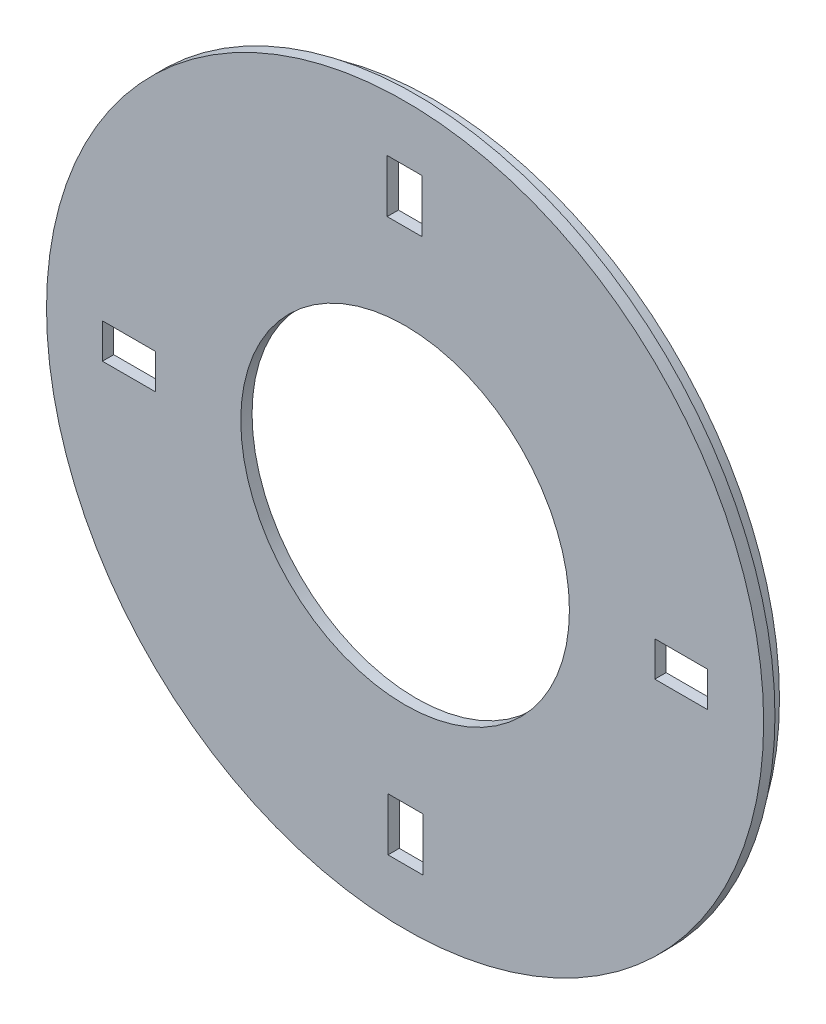
ISO-10303-21;
HEADER;
FILE_DESCRIPTION(('STEP AP214'),'2;1');
FILE_NAME('part.step','',(''),(''),'','','');
FILE_SCHEMA(('AUTOMOTIVE_DESIGN { 1 0 10303 214 1 1 1 1 }'));
ENDSEC;
DATA;
#1=APPLICATION_CONTEXT('core data for automotive mechanical design processes');
#2=APPLICATION_PROTOCOL_DEFINITION('international standard','automotive_design',2000,#1);
#3=PRODUCT_CONTEXT('',#1,'mechanical');
#4=PRODUCT('Part','Part','',(#3));
#5=PRODUCT_RELATED_PRODUCT_CATEGORY('part','',(#4));
#6=PRODUCT_DEFINITION_FORMATION('','',#4);
#7=PRODUCT_DEFINITION_CONTEXT('part definition',#1,'design');
#8=PRODUCT_DEFINITION('design','',#6,#7);
#9=PRODUCT_DEFINITION_SHAPE('','',#8);
#10=(LENGTH_UNIT() NAMED_UNIT(*) SI_UNIT(.MILLI.,.METRE.));
#11=(NAMED_UNIT(*) PLANE_ANGLE_UNIT() SI_UNIT($,.RADIAN.));
#12=(NAMED_UNIT(*) SI_UNIT($,.STERADIAN.) SOLID_ANGLE_UNIT());
#13=UNCERTAINTY_MEASURE_WITH_UNIT(LENGTH_MEASURE(1.E-05),#10,'distance_accuracy_value','');
#14=(GEOMETRIC_REPRESENTATION_CONTEXT(3) GLOBAL_UNCERTAINTY_ASSIGNED_CONTEXT((#13)) GLOBAL_UNIT_ASSIGNED_CONTEXT((#10,
#11,#12)) REPRESENTATION_CONTEXT('',''));
#15=CARTESIAN_POINT('',(0.,0.,0.));
#16=DIRECTION('',(0.,0.,1.));
#17=DIRECTION('',(1.,0.,0.));
#18=AXIS2_PLACEMENT_3D('',#15,#16,#17);
#19=CARTESIAN_POINT('',(0.,0.,0.));
#20=DIRECTION('',(0.,0.,1.));
#21=DIRECTION('',(1.,0.,0.));
#22=AXIS2_PLACEMENT_3D('',#19,#20,#21);
#23=PLANE('',#22);
#24=DIRECTION('',(-1.,0.,0.));
#25=VECTOR('',#24,1.);
#26=CARTESIAN_POINT('',(3.17213324801856,-44.2196209835935,0.));
#27=LINE('',#26,#25);
#28=CARTESIAN_POINT('',(3.17213324801856,-44.2196209835935,0.));
#29=VERTEX_POINT('',#28);
#30=CARTESIAN_POINT('',(-3.02546675198144,-44.2196209835934,0.));
#31=VERTEX_POINT('',#30);
#32=EDGE_CURVE('E75',#29,#31,#27,.T.);
#33=ORIENTED_EDGE('',*,*,#32,.T.);
#34=DIRECTION('',(0.,-1.,0.));
#35=VECTOR('',#34,1.);
#36=CARTESIAN_POINT('',(-3.02546675198154,-53.5922209835934,0.));
#37=LINE('',#36,#35);
#38=CARTESIAN_POINT('',(-3.02546675198154,-53.5922209835934,0.));
#39=VERTEX_POINT('',#38);
#40=EDGE_CURVE('E181',#31,#39,#37,.T.);
#41=ORIENTED_EDGE('',*,*,#40,.T.);
#42=DIRECTION('',(1.,0.,0.));
#43=VECTOR('',#42,1.);
#44=CARTESIAN_POINT('',(3.17213324801846,-53.5922209835935,0.));
#45=LINE('',#44,#43);
#46=CARTESIAN_POINT('',(3.17213324801846,-53.5922209835935,0.));
#47=VERTEX_POINT('',#46);
#48=EDGE_CURVE('E203',#39,#47,#45,.T.);
#49=ORIENTED_EDGE('',*,*,#48,.T.);
#50=DIRECTION('',(0.,1.,0.));
#51=VECTOR('',#50,1.);
#52=CARTESIAN_POINT('',(3.17213324801846,-53.5922209835935,0.));
#53=LINE('',#52,#51);
#54=EDGE_CURVE('E175',#47,#29,#53,.T.);
#55=ORIENTED_EDGE('',*,*,#54,.T.);
#56=EDGE_LOOP('',(#33,#41,#49,#55));
#57=FACE_BOUND('',#56,.T.);
#58=DIRECTION('',(1.,0.,0.));
#59=VECTOR('',#58,1.);
#60=CARTESIAN_POINT('',(-3.17213324801887,44.2196209835935,0.));
#61=LINE('',#60,#59);
#62=CARTESIAN_POINT('',(-3.17213324801887,44.2196209835935,0.));
#63=VERTEX_POINT('',#62);
#64=CARTESIAN_POINT('',(3.02546675198113,44.2196209835934,0.));
#65=VERTEX_POINT('',#64);
#66=EDGE_CURVE('E258',#63,#65,#61,.T.);
#67=ORIENTED_EDGE('',*,*,#66,.T.);
#68=DIRECTION('',(0.,1.,0.));
#69=VECTOR('',#68,1.);
#70=CARTESIAN_POINT('',(3.02546675198116,53.5922209835934,0.));
#71=LINE('',#70,#69);
#72=CARTESIAN_POINT('',(3.02546675198116,53.5922209835934,0.));
#73=VERTEX_POINT('',#72);
#74=EDGE_CURVE('E277',#65,#73,#71,.T.);
#75=ORIENTED_EDGE('',*,*,#74,.T.);
#76=DIRECTION('',(-1.,0.,0.));
#77=VECTOR('',#76,1.);
#78=CARTESIAN_POINT('',(-3.17213324801884,53.5922209835934,0.));
#79=LINE('',#78,#77);
#80=CARTESIAN_POINT('',(-3.17213324801884,53.5922209835934,0.));
#81=VERTEX_POINT('',#80);
#82=EDGE_CURVE('E281',#73,#81,#79,.T.);
#83=ORIENTED_EDGE('',*,*,#82,.T.);
#84=DIRECTION('',(0.,-1.,0.));
#85=VECTOR('',#84,1.);
#86=CARTESIAN_POINT('',(-3.17213324801884,53.5922209835934,0.));
#87=LINE('',#86,#85);
#88=EDGE_CURVE('E263',#81,#63,#87,.T.);
#89=ORIENTED_EDGE('',*,*,#88,.T.);
#90=EDGE_LOOP('',(#67,#75,#83,#89));
#91=FACE_BOUND('',#90,.T.);
#92=CARTESIAN_POINT('',(0.,0.,0.));
#93=DIRECTION('',(0.,0.,1.));
#94=DIRECTION('',(1.,0.,0.));
#95=AXIS2_PLACEMENT_3D('',#92,#93,#94);
#96=CIRCLE('',#95,29.1);
#97=CARTESIAN_POINT('',(29.1,0.,0.));
#98=VERTEX_POINT('',#97);
#99=EDGE_CURVE('E344',#98,#98,#96,.T.);
#100=ORIENTED_EDGE('',*,*,#99,.T.);
#101=EDGE_LOOP('',(#100));
#102=FACE_BOUND('',#101,.T.);
#103=DIRECTION('',(-1.,0.,0.));
#104=VECTOR('',#103,1.);
#105=CARTESIAN_POINT('',(-53.5922209835934,3.02546675198097,0.));
#106=LINE('',#105,#104);
#107=CARTESIAN_POINT('',(-44.2196209835935,3.02546675198098,0.));
#108=VERTEX_POINT('',#107);
#109=CARTESIAN_POINT('',(-53.5922209835934,3.02546675198097,0.));
#110=VERTEX_POINT('',#109);
#111=EDGE_CURVE('E301',#108,#110,#106,.T.);
#112=ORIENTED_EDGE('',*,*,#111,.T.);
#113=DIRECTION('',(0.,-1.,0.));
#114=VECTOR('',#113,1.);
#115=CARTESIAN_POINT('',(-53.5922209835934,-3.17213324801902,0.));
#116=LINE('',#115,#114);
#117=CARTESIAN_POINT('',(-53.5922209835934,-3.17213324801902,0.));
#118=VERTEX_POINT('',#117);
#119=EDGE_CURVE('E320',#110,#118,#116,.T.);
#120=ORIENTED_EDGE('',*,*,#119,.T.);
#121=DIRECTION('',(1.,0.,0.));
#122=VECTOR('',#121,1.);
#123=CARTESIAN_POINT('',(-53.5922209835934,-3.17213324801902,0.));
#124=LINE('',#123,#122);
#125=CARTESIAN_POINT('',(-44.2196209835934,-3.17213324801902,0.));
#126=VERTEX_POINT('',#125);
#127=EDGE_CURVE('E324',#118,#126,#124,.T.);
#128=ORIENTED_EDGE('',*,*,#127,.T.);
#129=DIRECTION('',(0.,1.,0.));
#130=VECTOR('',#129,1.);
#131=CARTESIAN_POINT('',(-44.2196209835934,-3.17213324801902,0.));
#132=LINE('',#131,#130);
#133=EDGE_CURVE('E306',#126,#108,#132,.T.);
#134=ORIENTED_EDGE('',*,*,#133,.T.);
#135=EDGE_LOOP('',(#112,#120,#128,#134));
#136=FACE_BOUND('',#135,.T.);
#137=DIRECTION('',(0.,-1.,0.));
#138=VECTOR('',#137,1.);
#139=CARTESIAN_POINT('',(44.2196209835935,3.17213324801871,0.));
#140=LINE('',#139,#138);
#141=CARTESIAN_POINT('',(44.2196209835935,3.17213324801871,0.));
#142=VERTEX_POINT('',#141);
#143=CARTESIAN_POINT('',(44.2196209835934,-3.02546675198129,0.));
#144=VERTEX_POINT('',#143);
#145=EDGE_CURVE('E183',#142,#144,#140,.T.);
#146=ORIENTED_EDGE('',*,*,#145,.T.);
#147=DIRECTION('',(1.,0.,0.));
#148=VECTOR('',#147,1.);
#149=CARTESIAN_POINT('',(53.5922209835934,-3.02546675198135,0.));
#150=LINE('',#149,#148);
#151=CARTESIAN_POINT('',(53.5922209835934,-3.02546675198135,0.));
#152=VERTEX_POINT('',#151);
#153=EDGE_CURVE('E234',#144,#152,#150,.T.);
#154=ORIENTED_EDGE('',*,*,#153,.T.);
#155=DIRECTION('',(0.,1.,0.));
#156=VECTOR('',#155,1.);
#157=CARTESIAN_POINT('',(53.5922209835934,3.17213324801865,0.));
#158=LINE('',#157,#156);
#159=CARTESIAN_POINT('',(53.5922209835934,3.17213324801865,0.));
#160=VERTEX_POINT('',#159);
#161=EDGE_CURVE('E238',#152,#160,#158,.T.);
#162=ORIENTED_EDGE('',*,*,#161,.T.);
#163=DIRECTION('',(-1.,0.,0.));
#164=VECTOR('',#163,1.);
#165=CARTESIAN_POINT('',(53.5922209835934,3.17213324801865,0.));
#166=LINE('',#165,#164);
#167=EDGE_CURVE('E220',#160,#142,#166,.T.);
#168=ORIENTED_EDGE('',*,*,#167,.T.);
#169=EDGE_LOOP('',(#146,#154,#162,#168));
#170=FACE_BOUND('',#169,.T.);
#171=CARTESIAN_POINT('',(0.,0.,0.));
#172=DIRECTION('',(0.,0.,-1.));
#173=DIRECTION('',(-1.,0.,0.));
#174=AXIS2_PLACEMENT_3D('',#171,#172,#173);
#175=CIRCLE('',#174,59.8);
#176=CARTESIAN_POINT('',(-59.8,0.,0.));
#177=VERTEX_POINT('',#176);
#178=EDGE_CURVE('E386',#177,#177,#175,.T.);
#179=ORIENTED_EDGE('',*,*,#178,.T.);
#180=EDGE_LOOP('',(#179));
#181=FACE_BOUND('',#180,.T.);
#182=ADVANCED_FACE('F51',(#57,#91,#102,#136,#170,#181),#23,.F.);
#183=CARTESIAN_POINT('',(0.,0.,2.));
#184=DIRECTION('',(0.,0.,1.));
#185=DIRECTION('',(1.,0.,0.));
#186=AXIS2_PLACEMENT_3D('',#183,#184,#185);
#187=PLANE('',#186);
#188=CARTESIAN_POINT('',(0.,0.,2.));
#189=DIRECTION('',(0.,0.,1.));
#190=DIRECTION('',(1.,0.,0.));
#191=AXIS2_PLACEMENT_3D('',#188,#189,#190);
#192=CIRCLE('',#191,63.5);
#193=CARTESIAN_POINT('',(63.5,0.,2.));
#194=VERTEX_POINT('',#193);
#195=EDGE_CURVE('E60',#194,#194,#192,.T.);
#196=ORIENTED_EDGE('',*,*,#195,.T.);
#197=EDGE_LOOP('',(#196));
#198=FACE_BOUND('',#197,.T.);
#199=CARTESIAN_POINT('',(0.,0.,2.));
#200=DIRECTION('',(0.,0.,1.));
#201=DIRECTION('',(1.,0.,0.));
#202=AXIS2_PLACEMENT_3D('',#199,#200,#201);
#203=CIRCLE('',#202,29.1);
#204=CARTESIAN_POINT('',(29.1,0.,2.));
#205=VERTEX_POINT('',#204);
#206=EDGE_CURVE('E345',#205,#205,#203,.T.);
#207=ORIENTED_EDGE('',*,*,#206,.F.);
#208=EDGE_LOOP('',(#207));
#209=FACE_BOUND('',#208,.T.);
#210=DIRECTION('',(0.,-1.,0.));
#211=VECTOR('',#210,1.);
#212=CARTESIAN_POINT('',(-53.5922209835934,-3.17213324801902,2.));
#213=LINE('',#212,#211);
#214=CARTESIAN_POINT('',(-53.5922209835934,3.02546675198097,2.));
#215=VERTEX_POINT('',#214);
#216=CARTESIAN_POINT('',(-53.5922209835934,-3.17213324801902,2.));
#217=VERTEX_POINT('',#216);
#218=EDGE_CURVE('E305',#215,#217,#213,.T.);
#219=ORIENTED_EDGE('',*,*,#218,.F.);
#220=DIRECTION('',(-1.,0.,0.));
#221=VECTOR('',#220,1.);
#222=CARTESIAN_POINT('',(-53.5922209835934,3.02546675198097,2.));
#223=LINE('',#222,#221);
#224=CARTESIAN_POINT('',(-44.2196209835935,3.02546675198098,2.));
#225=VERTEX_POINT('',#224);
#226=EDGE_CURVE('E302',#225,#215,#223,.T.);
#227=ORIENTED_EDGE('',*,*,#226,.F.);
#228=DIRECTION('',(0.,1.,0.));
#229=VECTOR('',#228,1.);
#230=CARTESIAN_POINT('',(-44.2196209835934,-3.17213324801902,2.));
#231=LINE('',#230,#229);
#232=CARTESIAN_POINT('',(-44.2196209835934,-3.17213324801902,2.));
#233=VERTEX_POINT('',#232);
#234=EDGE_CURVE('E313',#233,#225,#231,.T.);
#235=ORIENTED_EDGE('',*,*,#234,.F.);
#236=DIRECTION('',(1.,0.,0.));
#237=VECTOR('',#236,1.);
#238=CARTESIAN_POINT('',(-53.5922209835934,-3.17213324801902,2.));
#239=LINE('',#238,#237);
#240=EDGE_CURVE('E309',#217,#233,#239,.T.);
#241=ORIENTED_EDGE('',*,*,#240,.F.);
#242=EDGE_LOOP('',(#219,#227,#235,#241));
#243=FACE_BOUND('',#242,.T.);
#244=DIRECTION('',(0.,1.,0.));
#245=VECTOR('',#244,1.);
#246=CARTESIAN_POINT('',(3.02546675198116,53.5922209835934,2.));
#247=LINE('',#246,#245);
#248=CARTESIAN_POINT('',(3.02546675198113,44.2196209835934,2.));
#249=VERTEX_POINT('',#248);
#250=CARTESIAN_POINT('',(3.02546675198116,53.5922209835934,2.));
#251=VERTEX_POINT('',#250);
#252=EDGE_CURVE('E262',#249,#251,#247,.T.);
#253=ORIENTED_EDGE('',*,*,#252,.F.);
#254=DIRECTION('',(1.,0.,0.));
#255=VECTOR('',#254,1.);
#256=CARTESIAN_POINT('',(-3.17213324801887,44.2196209835935,2.));
#257=LINE('',#256,#255);
#258=CARTESIAN_POINT('',(-3.17213324801887,44.2196209835935,2.));
#259=VERTEX_POINT('',#258);
#260=EDGE_CURVE('E259',#259,#249,#257,.T.);
#261=ORIENTED_EDGE('',*,*,#260,.F.);
#262=DIRECTION('',(0.,-1.,0.));
#263=VECTOR('',#262,1.);
#264=CARTESIAN_POINT('',(-3.17213324801884,53.5922209835934,2.));
#265=LINE('',#264,#263);
#266=CARTESIAN_POINT('',(-3.17213324801884,53.5922209835934,2.));
#267=VERTEX_POINT('',#266);
#268=EDGE_CURVE('E270',#267,#259,#265,.T.);
#269=ORIENTED_EDGE('',*,*,#268,.F.);
#270=DIRECTION('',(-1.,0.,0.));
#271=VECTOR('',#270,1.);
#272=CARTESIAN_POINT('',(-3.17213324801884,53.5922209835934,2.));
#273=LINE('',#272,#271);
#274=EDGE_CURVE('E266',#251,#267,#273,.T.);
#275=ORIENTED_EDGE('',*,*,#274,.F.);
#276=EDGE_LOOP('',(#253,#261,#269,#275));
#277=FACE_BOUND('',#276,.T.);
#278=DIRECTION('',(1.,0.,0.));
#279=VECTOR('',#278,1.);
#280=CARTESIAN_POINT('',(53.5922209835934,-3.02546675198135,2.));
#281=LINE('',#280,#279);
#282=CARTESIAN_POINT('',(44.2196209835934,-3.02546675198129,2.));
#283=VERTEX_POINT('',#282);
#284=CARTESIAN_POINT('',(53.5922209835934,-3.02546675198135,2.));
#285=VERTEX_POINT('',#284);
#286=EDGE_CURVE('E219',#283,#285,#281,.T.);
#287=ORIENTED_EDGE('',*,*,#286,.F.);
#288=DIRECTION('',(0.,-1.,0.));
#289=VECTOR('',#288,1.);
#290=CARTESIAN_POINT('',(44.2196209835935,3.17213324801871,2.));
#291=LINE('',#290,#289);
#292=CARTESIAN_POINT('',(44.2196209835935,3.17213324801871,2.));
#293=VERTEX_POINT('',#292);
#294=EDGE_CURVE('E216',#293,#283,#291,.T.);
#295=ORIENTED_EDGE('',*,*,#294,.F.);
#296=DIRECTION('',(-1.,0.,0.));
#297=VECTOR('',#296,1.);
#298=CARTESIAN_POINT('',(53.5922209835934,3.17213324801865,2.));
#299=LINE('',#298,#297);
#300=CARTESIAN_POINT('',(53.5922209835934,3.17213324801865,2.));
#301=VERTEX_POINT('',#300);
#302=EDGE_CURVE('E227',#301,#293,#299,.T.);
#303=ORIENTED_EDGE('',*,*,#302,.F.);
#304=DIRECTION('',(0.,1.,0.));
#305=VECTOR('',#304,1.);
#306=CARTESIAN_POINT('',(53.5922209835934,3.17213324801865,2.));
#307=LINE('',#306,#305);
#308=EDGE_CURVE('E223',#285,#301,#307,.T.);
#309=ORIENTED_EDGE('',*,*,#308,.F.);
#310=EDGE_LOOP('',(#287,#295,#303,#309));
#311=FACE_BOUND('',#310,.T.);
#312=DIRECTION('',(0.,-1.,0.));
#313=VECTOR('',#312,1.);
#314=CARTESIAN_POINT('',(-3.02546675198154,-53.5922209835934,2.));
#315=LINE('',#314,#313);
#316=CARTESIAN_POINT('',(-3.02546675198144,-44.2196209835934,2.));
#317=VERTEX_POINT('',#316);
#318=CARTESIAN_POINT('',(-3.02546675198154,-53.5922209835934,2.));
#319=VERTEX_POINT('',#318);
#320=EDGE_CURVE('E174',#317,#319,#315,.T.);
#321=ORIENTED_EDGE('',*,*,#320,.F.);
#322=DIRECTION('',(-1.,0.,0.));
#323=VECTOR('',#322,1.);
#324=CARTESIAN_POINT('',(3.17213324801856,-44.2196209835935,2.));
#325=LINE('',#324,#323);
#326=CARTESIAN_POINT('',(3.17213324801856,-44.2196209835935,2.));
#327=VERTEX_POINT('',#326);
#328=EDGE_CURVE('E165',#327,#317,#325,.T.);
#329=ORIENTED_EDGE('',*,*,#328,.F.);
#330=DIRECTION('',(0.,1.,0.));
#331=VECTOR('',#330,1.);
#332=CARTESIAN_POINT('',(3.17213324801846,-53.5922209835935,2.));
#333=LINE('',#332,#331);
#334=CARTESIAN_POINT('',(3.17213324801846,-53.5922209835935,2.));
#335=VERTEX_POINT('',#334);
#336=EDGE_CURVE('E192',#335,#327,#333,.T.);
#337=ORIENTED_EDGE('',*,*,#336,.F.);
#338=DIRECTION('',(1.,0.,0.));
#339=VECTOR('',#338,1.);
#340=CARTESIAN_POINT('',(3.17213324801846,-53.5922209835935,2.));
#341=LINE('',#340,#339);
#342=EDGE_CURVE('E188',#319,#335,#341,.T.);
#343=ORIENTED_EDGE('',*,*,#342,.F.);
#344=EDGE_LOOP('',(#321,#329,#337,#343));
#345=FACE_BOUND('',#344,.T.);
#346=ADVANCED_FACE('F187',(#198,#209,#243,#277,#311,#345),#187,.T.);
#347=CARTESIAN_POINT('',(0.,0.,0.));
#348=DIRECTION('',(0.,0.,1.));
#349=DIRECTION('',(1.,0.,0.));
#350=AXIS2_PLACEMENT_3D('',#347,#348,#349);
#351=CIRCLE('',#350,61.3);
#352=CARTESIAN_POINT('',(61.3,0.,0.));
#353=VERTEX_POINT('',#352);
#354=EDGE_CURVE('E11',#353,#353,#351,.F.);
#355=ORIENTED_EDGE('',*,*,#354,.F.);
#356=EDGE_LOOP('',(#355));
#357=FACE_BOUND('',#356,.T.);
#358=CARTESIAN_POINT('',(0.,0.,0.));
#359=DIRECTION('',(0.,0.,1.));
#360=DIRECTION('',(1.,0.,0.));
#361=AXIS2_PLACEMENT_3D('',#358,#359,#360);
#362=CIRCLE('',#361,63.5);
#363=CARTESIAN_POINT('',(63.5,0.,0.));
#364=VERTEX_POINT('',#363);
#365=EDGE_CURVE('E349',#364,#364,#362,.T.);
#366=ORIENTED_EDGE('',*,*,#365,.F.);
#367=EDGE_LOOP('',(#366));
#368=FACE_BOUND('',#367,.T.);
#369=ADVANCED_FACE('F360',(#357,#368),#23,.F.);
#370=CARTESIAN_POINT('',(0.,0.,2.));
#371=DIRECTION('',(0.,0.,-1.));
#372=DIRECTION('',(-1.,0.,0.));
#373=AXIS2_PLACEMENT_3D('',#370,#371,#372);
#374=CYLINDRICAL_SURFACE('',#373,63.5);
#375=ORIENTED_EDGE('',*,*,#195,.F.);
#376=EDGE_LOOP('',(#375));
#377=FACE_BOUND('',#376,.T.);
#378=ORIENTED_EDGE('',*,*,#365,.T.);
#379=EDGE_LOOP('',(#378));
#380=FACE_BOUND('',#379,.T.);
#381=ADVANCED_FACE('F53',(#377,#380),#374,.T.);
#382=CARTESIAN_POINT('',(0.,0.,2.));
#383=DIRECTION('',(0.,0.,-1.));
#384=DIRECTION('',(-1.,0.,0.));
#385=AXIS2_PLACEMENT_3D('',#382,#383,#384);
#386=CYLINDRICAL_SURFACE('',#385,29.1);
#387=ORIENTED_EDGE('',*,*,#206,.T.);
#388=EDGE_LOOP('',(#387));
#389=FACE_BOUND('',#388,.T.);
#390=ORIENTED_EDGE('',*,*,#99,.F.);
#391=EDGE_LOOP('',(#390));
#392=FACE_BOUND('',#391,.T.);
#393=ADVANCED_FACE('F368',(#389,#392),#386,.F.);
#394=CARTESIAN_POINT('',(-53.5922209835934,3.02546675198097,2.));
#395=DIRECTION('',(0.,-1.,0.));
#396=DIRECTION('',(1.,0.,0.));
#397=AXIS2_PLACEMENT_3D('',#394,#395,#396);
#398=PLANE('',#397);
#399=ORIENTED_EDGE('',*,*,#111,.F.);
#400=DIRECTION('',(0.,0.,-1.));
#401=VECTOR('',#400,1.);
#402=CARTESIAN_POINT('',(-44.2196209835935,3.02546675198098,2.));
#403=LINE('',#402,#401);
#404=EDGE_CURVE('E316',#225,#108,#403,.T.);
#405=ORIENTED_EDGE('',*,*,#404,.F.);
#406=ORIENTED_EDGE('',*,*,#226,.T.);
#407=DIRECTION('',(0.,0.,-1.));
#408=VECTOR('',#407,1.);
#409=CARTESIAN_POINT('',(-53.5922209835934,3.02546675198097,2.));
#410=LINE('',#409,#408);
#411=EDGE_CURVE('E340',#215,#110,#410,.T.);
#412=ORIENTED_EDGE('',*,*,#411,.T.);
#413=EDGE_LOOP('',(#399,#405,#406,#412));
#414=FACE_BOUND('',#413,.T.);
#415=ADVANCED_FACE('F467',(#414),#398,.T.);
#416=CARTESIAN_POINT('',(-53.5922209835934,-3.17213324801902,2.));
#417=DIRECTION('',(1.,0.,0.));
#418=DIRECTION('',(0.,1.,0.));
#419=AXIS2_PLACEMENT_3D('',#416,#417,#418);
#420=PLANE('',#419);
#421=ORIENTED_EDGE('',*,*,#119,.F.);
#422=ORIENTED_EDGE('',*,*,#411,.F.);
#423=ORIENTED_EDGE('',*,*,#218,.T.);
#424=DIRECTION('',(0.,0.,-1.));
#425=VECTOR('',#424,1.);
#426=CARTESIAN_POINT('',(-53.5922209835934,-3.17213324801902,2.));
#427=LINE('',#426,#425);
#428=EDGE_CURVE('E337',#217,#118,#427,.T.);
#429=ORIENTED_EDGE('',*,*,#428,.T.);
#430=EDGE_LOOP('',(#421,#422,#423,#429));
#431=FACE_BOUND('',#430,.T.);
#432=ADVANCED_FACE('F463',(#431),#420,.T.);
#433=CARTESIAN_POINT('',(-53.5922209835934,-3.17213324801902,2.));
#434=DIRECTION('',(0.,1.,0.));
#435=DIRECTION('',(-1.,0.,0.));
#436=AXIS2_PLACEMENT_3D('',#433,#434,#435);
#437=PLANE('',#436);
#438=ORIENTED_EDGE('',*,*,#127,.F.);
#439=ORIENTED_EDGE('',*,*,#428,.F.);
#440=ORIENTED_EDGE('',*,*,#240,.T.);
#441=DIRECTION('',(0.,0.,-1.));
#442=VECTOR('',#441,1.);
#443=CARTESIAN_POINT('',(-44.2196209835934,-3.17213324801902,2.));
#444=LINE('',#443,#442);
#445=EDGE_CURVE('E334',#233,#126,#444,.T.);
#446=ORIENTED_EDGE('',*,*,#445,.T.);
#447=EDGE_LOOP('',(#438,#439,#440,#446));
#448=FACE_BOUND('',#447,.T.);
#449=ADVANCED_FACE('F459',(#448),#437,.T.);
#450=CARTESIAN_POINT('',(-44.2196209835934,-3.17213324801902,2.));
#451=DIRECTION('',(-1.,0.,0.));
#452=DIRECTION('',(0.,-1.,0.));
#453=AXIS2_PLACEMENT_3D('',#450,#451,#452);
#454=PLANE('',#453);
#455=ORIENTED_EDGE('',*,*,#133,.F.);
#456=ORIENTED_EDGE('',*,*,#445,.F.);
#457=ORIENTED_EDGE('',*,*,#234,.T.);
#458=ORIENTED_EDGE('',*,*,#404,.T.);
#459=EDGE_LOOP('',(#455,#456,#457,#458));
#460=FACE_BOUND('',#459,.T.);
#461=ADVANCED_FACE('F455',(#460),#454,.T.);
#462=CARTESIAN_POINT('',(-3.17213324801887,44.2196209835935,2.));
#463=DIRECTION('',(0.,1.,0.));
#464=DIRECTION('',(-1.,0.,0.));
#465=AXIS2_PLACEMENT_3D('',#462,#463,#464);
#466=PLANE('',#465);
#467=ORIENTED_EDGE('',*,*,#66,.F.);
#468=DIRECTION('',(0.,0.,-1.));
#469=VECTOR('',#468,1.);
#470=CARTESIAN_POINT('',(-3.17213324801887,44.2196209835935,2.));
#471=LINE('',#470,#469);
#472=EDGE_CURVE('E273',#259,#63,#471,.T.);
#473=ORIENTED_EDGE('',*,*,#472,.F.);
#474=ORIENTED_EDGE('',*,*,#260,.T.);
#475=DIRECTION('',(0.,0.,-1.));
#476=VECTOR('',#475,1.);
#477=CARTESIAN_POINT('',(3.02546675198113,44.2196209835934,2.));
#478=LINE('',#477,#476);
#479=EDGE_CURVE('E297',#249,#65,#478,.T.);
#480=ORIENTED_EDGE('',*,*,#479,.T.);
#481=EDGE_LOOP('',(#467,#473,#474,#480));
#482=FACE_BOUND('',#481,.T.);
#483=ADVANCED_FACE('F451',(#482),#466,.T.);
#484=CARTESIAN_POINT('',(3.02546675198116,53.5922209835934,2.));
#485=DIRECTION('',(-1.,0.,0.));
#486=DIRECTION('',(0.,-1.,0.));
#487=AXIS2_PLACEMENT_3D('',#484,#485,#486);
#488=PLANE('',#487);
#489=ORIENTED_EDGE('',*,*,#74,.F.);
#490=ORIENTED_EDGE('',*,*,#479,.F.);
#491=ORIENTED_EDGE('',*,*,#252,.T.);
#492=DIRECTION('',(0.,0.,-1.));
#493=VECTOR('',#492,1.);
#494=CARTESIAN_POINT('',(3.02546675198116,53.5922209835934,2.));
#495=LINE('',#494,#493);
#496=EDGE_CURVE('E294',#251,#73,#495,.T.);
#497=ORIENTED_EDGE('',*,*,#496,.T.);
#498=EDGE_LOOP('',(#489,#490,#491,#497));
#499=FACE_BOUND('',#498,.T.);
#500=ADVANCED_FACE('F447',(#499),#488,.T.);
#501=CARTESIAN_POINT('',(-3.17213324801884,53.5922209835934,2.));
#502=DIRECTION('',(0.,-1.,0.));
#503=DIRECTION('',(1.,0.,0.));
#504=AXIS2_PLACEMENT_3D('',#501,#502,#503);
#505=PLANE('',#504);
#506=ORIENTED_EDGE('',*,*,#82,.F.);
#507=ORIENTED_EDGE('',*,*,#496,.F.);
#508=ORIENTED_EDGE('',*,*,#274,.T.);
#509=DIRECTION('',(0.,0.,-1.));
#510=VECTOR('',#509,1.);
#511=CARTESIAN_POINT('',(-3.17213324801884,53.5922209835934,2.));
#512=LINE('',#511,#510);
#513=EDGE_CURVE('E291',#267,#81,#512,.T.);
#514=ORIENTED_EDGE('',*,*,#513,.T.);
#515=EDGE_LOOP('',(#506,#507,#508,#514));
#516=FACE_BOUND('',#515,.T.);
#517=ADVANCED_FACE('F443',(#516),#505,.T.);
#518=CARTESIAN_POINT('',(-3.17213324801884,53.5922209835934,2.));
#519=DIRECTION('',(1.,0.,0.));
#520=DIRECTION('',(0.,1.,0.));
#521=AXIS2_PLACEMENT_3D('',#518,#519,#520);
#522=PLANE('',#521);
#523=ORIENTED_EDGE('',*,*,#88,.F.);
#524=ORIENTED_EDGE('',*,*,#513,.F.);
#525=ORIENTED_EDGE('',*,*,#268,.T.);
#526=ORIENTED_EDGE('',*,*,#472,.T.);
#527=EDGE_LOOP('',(#523,#524,#525,#526));
#528=FACE_BOUND('',#527,.T.);
#529=ADVANCED_FACE('F439',(#528),#522,.T.);
#530=CARTESIAN_POINT('',(44.2196209835935,3.17213324801871,2.));
#531=DIRECTION('',(1.,0.,0.));
#532=DIRECTION('',(0.,1.,0.));
#533=AXIS2_PLACEMENT_3D('',#530,#531,#532);
#534=PLANE('',#533);
#535=ORIENTED_EDGE('',*,*,#145,.F.);
#536=DIRECTION('',(0.,0.,-1.));
#537=VECTOR('',#536,1.);
#538=CARTESIAN_POINT('',(44.2196209835935,3.17213324801871,2.));
#539=LINE('',#538,#537);
#540=EDGE_CURVE('E230',#293,#142,#539,.T.);
#541=ORIENTED_EDGE('',*,*,#540,.F.);
#542=ORIENTED_EDGE('',*,*,#294,.T.);
#543=DIRECTION('',(0.,0.,-1.));
#544=VECTOR('',#543,1.);
#545=CARTESIAN_POINT('',(44.2196209835934,-3.02546675198129,2.));
#546=LINE('',#545,#544);
#547=EDGE_CURVE('E254',#283,#144,#546,.T.);
#548=ORIENTED_EDGE('',*,*,#547,.T.);
#549=EDGE_LOOP('',(#535,#541,#542,#548));
#550=FACE_BOUND('',#549,.T.);
#551=ADVANCED_FACE('F435',(#550),#534,.T.);
#552=CARTESIAN_POINT('',(53.5922209835934,-3.02546675198135,2.));
#553=DIRECTION('',(0.,1.,0.));
#554=DIRECTION('',(-1.,0.,0.));
#555=AXIS2_PLACEMENT_3D('',#552,#553,#554);
#556=PLANE('',#555);
#557=ORIENTED_EDGE('',*,*,#153,.F.);
#558=ORIENTED_EDGE('',*,*,#547,.F.);
#559=ORIENTED_EDGE('',*,*,#286,.T.);
#560=DIRECTION('',(0.,0.,-1.));
#561=VECTOR('',#560,1.);
#562=CARTESIAN_POINT('',(53.5922209835934,-3.02546675198135,2.));
#563=LINE('',#562,#561);
#564=EDGE_CURVE('E251',#285,#152,#563,.T.);
#565=ORIENTED_EDGE('',*,*,#564,.T.);
#566=EDGE_LOOP('',(#557,#558,#559,#565));
#567=FACE_BOUND('',#566,.T.);
#568=ADVANCED_FACE('F431',(#567),#556,.T.);
#569=CARTESIAN_POINT('',(53.5922209835934,3.17213324801865,2.));
#570=DIRECTION('',(-1.,0.,0.));
#571=DIRECTION('',(0.,-1.,0.));
#572=AXIS2_PLACEMENT_3D('',#569,#570,#571);
#573=PLANE('',#572);
#574=ORIENTED_EDGE('',*,*,#161,.F.);
#575=ORIENTED_EDGE('',*,*,#564,.F.);
#576=ORIENTED_EDGE('',*,*,#308,.T.);
#577=DIRECTION('',(0.,0.,-1.));
#578=VECTOR('',#577,1.);
#579=CARTESIAN_POINT('',(53.5922209835934,3.17213324801865,2.));
#580=LINE('',#579,#578);
#581=EDGE_CURVE('E248',#301,#160,#580,.T.);
#582=ORIENTED_EDGE('',*,*,#581,.T.);
#583=EDGE_LOOP('',(#574,#575,#576,#582));
#584=FACE_BOUND('',#583,.T.);
#585=ADVANCED_FACE('F427',(#584),#573,.T.);
#586=CARTESIAN_POINT('',(53.5922209835934,3.17213324801865,2.));
#587=DIRECTION('',(0.,-1.,0.));
#588=DIRECTION('',(1.,0.,0.));
#589=AXIS2_PLACEMENT_3D('',#586,#587,#588);
#590=PLANE('',#589);
#591=ORIENTED_EDGE('',*,*,#167,.F.);
#592=ORIENTED_EDGE('',*,*,#581,.F.);
#593=ORIENTED_EDGE('',*,*,#302,.T.);
#594=ORIENTED_EDGE('',*,*,#540,.T.);
#595=EDGE_LOOP('',(#591,#592,#593,#594));
#596=FACE_BOUND('',#595,.T.);
#597=ADVANCED_FACE('F424',(#596),#590,.T.);
#598=CARTESIAN_POINT('',(3.17213324801856,-44.2196209835935,2.));
#599=DIRECTION('',(0.,-1.,0.));
#600=DIRECTION('',(1.,0.,0.));
#601=AXIS2_PLACEMENT_3D('',#598,#599,#600);
#602=PLANE('',#601);
#603=ORIENTED_EDGE('',*,*,#32,.F.);
#604=DIRECTION('',(0.,0.,-1.));
#605=VECTOR('',#604,1.);
#606=CARTESIAN_POINT('',(3.17213324801856,-44.2196209835935,2.));
#607=LINE('',#606,#605);
#608=EDGE_CURVE('E169',#327,#29,#607,.T.);
#609=ORIENTED_EDGE('',*,*,#608,.F.);
#610=ORIENTED_EDGE('',*,*,#328,.T.);
#611=DIRECTION('',(0.,0.,-1.));
#612=VECTOR('',#611,1.);
#613=CARTESIAN_POINT('',(-3.02546675198144,-44.2196209835934,2.));
#614=LINE('',#613,#612);
#615=EDGE_CURVE('E168',#317,#31,#614,.T.);
#616=ORIENTED_EDGE('',*,*,#615,.T.);
#617=EDGE_LOOP('',(#603,#609,#610,#616));
#618=FACE_BOUND('',#617,.T.);
#619=ADVANCED_FACE('F167',(#618),#602,.T.);
#620=CARTESIAN_POINT('',(-3.02546675198154,-53.5922209835934,2.));
#621=DIRECTION('',(1.,0.,0.));
#622=DIRECTION('',(0.,1.,0.));
#623=AXIS2_PLACEMENT_3D('',#620,#621,#622);
#624=PLANE('',#623);
#625=ORIENTED_EDGE('',*,*,#40,.F.);
#626=ORIENTED_EDGE('',*,*,#615,.F.);
#627=ORIENTED_EDGE('',*,*,#320,.T.);
#628=DIRECTION('',(0.,0.,-1.));
#629=VECTOR('',#628,1.);
#630=CARTESIAN_POINT('',(-3.02546675198154,-53.5922209835934,2.));
#631=LINE('',#630,#629);
#632=EDGE_CURVE('E184',#319,#39,#631,.T.);
#633=ORIENTED_EDGE('',*,*,#632,.T.);
#634=EDGE_LOOP('',(#625,#626,#627,#633));
#635=FACE_BOUND('',#634,.T.);
#636=ADVANCED_FACE('F178',(#635),#624,.T.);
#637=CARTESIAN_POINT('',(3.17213324801846,-53.5922209835935,2.));
#638=DIRECTION('',(0.,1.,0.));
#639=DIRECTION('',(-1.,0.,0.));
#640=AXIS2_PLACEMENT_3D('',#637,#638,#639);
#641=PLANE('',#640);
#642=ORIENTED_EDGE('',*,*,#48,.F.);
#643=ORIENTED_EDGE('',*,*,#632,.F.);
#644=ORIENTED_EDGE('',*,*,#342,.T.);
#645=DIRECTION('',(0.,0.,-1.));
#646=VECTOR('',#645,1.);
#647=CARTESIAN_POINT('',(3.17213324801846,-53.5922209835935,2.));
#648=LINE('',#647,#646);
#649=EDGE_CURVE('E67',#335,#47,#648,.T.);
#650=ORIENTED_EDGE('',*,*,#649,.T.);
#651=EDGE_LOOP('',(#642,#643,#644,#650));
#652=FACE_BOUND('',#651,.T.);
#653=ADVANCED_FACE('F416',(#652),#641,.T.);
#654=CARTESIAN_POINT('',(3.17213324801846,-53.5922209835935,2.));
#655=DIRECTION('',(-1.,0.,0.));
#656=DIRECTION('',(0.,-1.,0.));
#657=AXIS2_PLACEMENT_3D('',#654,#655,#656);
#658=PLANE('',#657);
#659=ORIENTED_EDGE('',*,*,#54,.F.);
#660=ORIENTED_EDGE('',*,*,#649,.F.);
#661=ORIENTED_EDGE('',*,*,#336,.T.);
#662=ORIENTED_EDGE('',*,*,#608,.T.);
#663=EDGE_LOOP('',(#659,#660,#661,#662));
#664=FACE_BOUND('',#663,.T.);
#665=ADVANCED_FACE('F412',(#664),#658,.T.);
#666=CARTESIAN_POINT('',(0.,0.,-3.));
#667=DIRECTION('',(0.,0.,-1.));
#668=DIRECTION('',(-1.,0.,0.));
#669=AXIS2_PLACEMENT_3D('',#666,#667,#668);
#670=PLANE('',#669);
#671=CARTESIAN_POINT('',(0.,0.,-3.));
#672=DIRECTION('',(0.,0.,-1.));
#673=DIRECTION('',(-1.,0.,0.));
#674=AXIS2_PLACEMENT_3D('',#671,#672,#673);
#675=CIRCLE('',#674,61.3);
#676=CARTESIAN_POINT('',(-61.3,0.,-3.));
#677=VERTEX_POINT('',#676);
#678=EDGE_CURVE('E200',#677,#677,#675,.T.);
#679=ORIENTED_EDGE('',*,*,#678,.T.);
#680=EDGE_LOOP('',(#679));
#681=FACE_BOUND('',#680,.T.);
#682=CARTESIAN_POINT('',(0.,0.,-3.));
#683=DIRECTION('',(0.,0.,-1.));
#684=DIRECTION('',(-1.,0.,0.));
#685=AXIS2_PLACEMENT_3D('',#682,#683,#684);
#686=CIRCLE('',#685,59.8);
#687=CARTESIAN_POINT('',(-59.8,0.,-3.));
#688=VERTEX_POINT('',#687);
#689=EDGE_CURVE('E389',#688,#688,#686,.T.);
#690=ORIENTED_EDGE('',*,*,#689,.F.);
#691=EDGE_LOOP('',(#690));
#692=FACE_BOUND('',#691,.T.);
#693=ADVANCED_FACE('F398',(#681,#692),#670,.T.);
#694=CARTESIAN_POINT('',(0.,0.,-3.));
#695=DIRECTION('',(0.,0.,1.));
#696=DIRECTION('',(1.,0.,0.));
#697=AXIS2_PLACEMENT_3D('',#694,#695,#696);
#698=CYLINDRICAL_SURFACE('',#697,61.3);
#699=ORIENTED_EDGE('',*,*,#678,.F.);
#700=EDGE_LOOP('',(#699));
#701=FACE_BOUND('',#700,.T.);
#702=ORIENTED_EDGE('',*,*,#354,.T.);
#703=EDGE_LOOP('',(#702));
#704=FACE_BOUND('',#703,.T.);
#705=ADVANCED_FACE('F401',(#701,#704),#698,.T.);
#706=CARTESIAN_POINT('',(0.,0.,-3.));
#707=DIRECTION('',(0.,0.,1.));
#708=DIRECTION('',(1.,0.,0.));
#709=AXIS2_PLACEMENT_3D('',#706,#707,#708);
#710=CYLINDRICAL_SURFACE('',#709,59.8);
#711=ORIENTED_EDGE('',*,*,#689,.T.);
#712=EDGE_LOOP('',(#711));
#713=FACE_BOUND('',#712,.T.);
#714=ORIENTED_EDGE('',*,*,#178,.F.);
#715=EDGE_LOOP('',(#714));
#716=FACE_BOUND('',#715,.T.);
#717=ADVANCED_FACE('F404',(#713,#716),#710,.F.);
#718=CLOSED_SHELL('',(#182,#346,#369,#381,#393,#415,#432,#449,#461,#483,#500,#517,#529,#551,
#568,#585,#597,#619,#636,#653,#665,#693,#705,#717));
#719=MANIFOLD_SOLID_BREP('B2',#718);
#720=ADVANCED_BREP_SHAPE_REPRESENTATION('',(#18,#719),#14);
#721=SHAPE_DEFINITION_REPRESENTATION(#9,#720);
ENDSEC;
END-ISO-10303-21;
